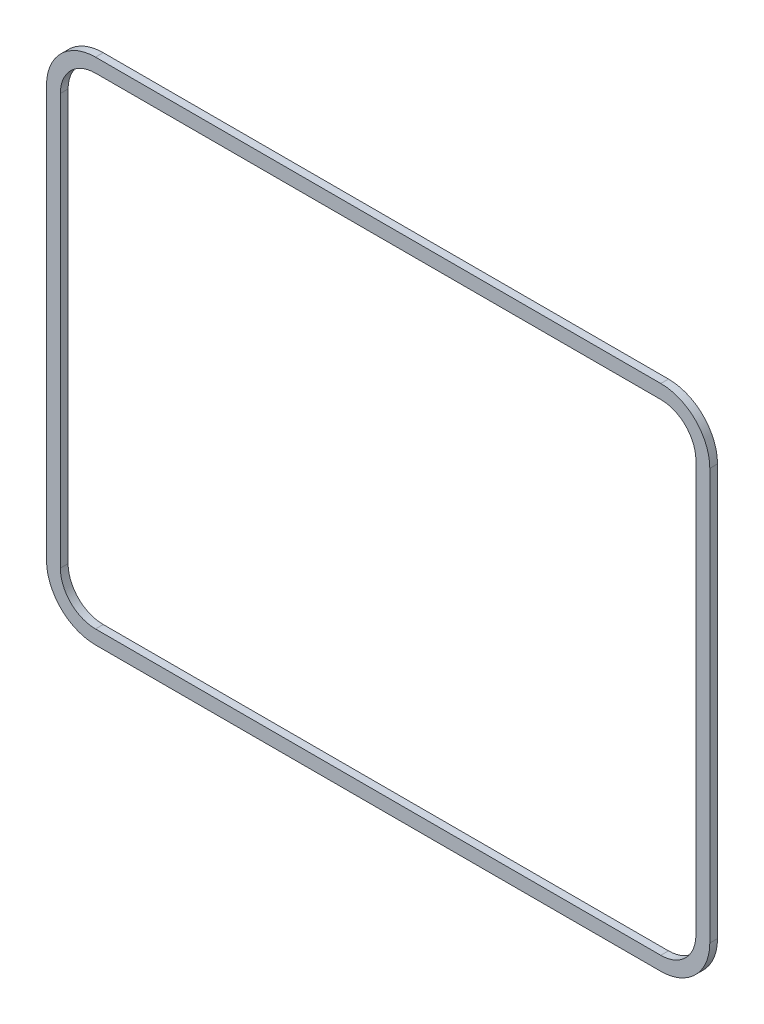
ISO-10303-21;
HEADER;
FILE_DESCRIPTION(('STEP AP214'),'2;1');
FILE_NAME('part.step','',(''),(''),'','','');
FILE_SCHEMA(('AUTOMOTIVE_DESIGN { 1 0 10303 214 1 1 1 1 }'));
ENDSEC;
DATA;
#1=APPLICATION_CONTEXT('core data for automotive mechanical design processes');
#2=APPLICATION_PROTOCOL_DEFINITION('international standard','automotive_design',2000,#1);
#3=PRODUCT_CONTEXT('',#1,'mechanical');
#4=PRODUCT('Part','Part','',(#3));
#5=PRODUCT_RELATED_PRODUCT_CATEGORY('part','',(#4));
#6=PRODUCT_DEFINITION_FORMATION('','',#4);
#7=PRODUCT_DEFINITION_CONTEXT('part definition',#1,'design');
#8=PRODUCT_DEFINITION('design','',#6,#7);
#9=PRODUCT_DEFINITION_SHAPE('','',#8);
#10=(LENGTH_UNIT() NAMED_UNIT(*) SI_UNIT(.MILLI.,.METRE.));
#11=(NAMED_UNIT(*) PLANE_ANGLE_UNIT() SI_UNIT($,.RADIAN.));
#12=(NAMED_UNIT(*) SI_UNIT($,.STERADIAN.) SOLID_ANGLE_UNIT());
#13=UNCERTAINTY_MEASURE_WITH_UNIT(LENGTH_MEASURE(1.E-05),#10,'distance_accuracy_value','');
#14=(GEOMETRIC_REPRESENTATION_CONTEXT(3) GLOBAL_UNCERTAINTY_ASSIGNED_CONTEXT((#13)) GLOBAL_UNIT_ASSIGNED_CONTEXT((#10,
#11,#12)) REPRESENTATION_CONTEXT('',''));
#15=CARTESIAN_POINT('',(0.,0.,0.));
#16=DIRECTION('',(0.,0.,1.));
#17=DIRECTION('',(1.,0.,0.));
#18=AXIS2_PLACEMENT_3D('',#15,#16,#17);
#19=CARTESIAN_POINT('',(-93.1,67.7,-2.54));
#20=DIRECTION('',(0.,0.,1.));
#21=DIRECTION('',(1.,0.,0.));
#22=AXIS2_PLACEMENT_3D('',#19,#20,#21);
#23=CYLINDRICAL_SURFACE('',#22,16.1454);
#24=CARTESIAN_POINT('',(-93.1,67.7,0.));
#25=DIRECTION('',(0.,0.,1.));
#26=DIRECTION('',(1.,0.,0.));
#27=AXIS2_PLACEMENT_3D('',#24,#25,#26);
#28=CIRCLE('',#27,16.1454);
#29=CARTESIAN_POINT('',(-93.1,83.8454,0.));
#30=VERTEX_POINT('',#29);
#31=CARTESIAN_POINT('',(-109.2454,67.7,0.));
#32=VERTEX_POINT('',#31);
#33=EDGE_CURVE('E209',#30,#32,#28,.T.);
#34=ORIENTED_EDGE('',*,*,#33,.F.);
#35=DIRECTION('',(0.,0.,1.));
#36=VECTOR('',#35,1.);
#37=CARTESIAN_POINT('',(-93.1,83.8454,-2.54));
#38=LINE('',#37,#36);
#39=CARTESIAN_POINT('',(-93.1,83.8454,-2.54));
#40=VERTEX_POINT('',#39);
#41=EDGE_CURVE('E11',#40,#30,#38,.T.);
#42=ORIENTED_EDGE('',*,*,#41,.F.);
#43=CARTESIAN_POINT('',(-93.1,67.7,-2.54));
#44=DIRECTION('',(0.,0.,1.));
#45=DIRECTION('',(1.,0.,0.));
#46=AXIS2_PLACEMENT_3D('',#43,#44,#45);
#47=CIRCLE('',#46,16.1454);
#48=CARTESIAN_POINT('',(-109.2454,67.7,-2.54));
#49=VERTEX_POINT('',#48);
#50=EDGE_CURVE('E221',#40,#49,#47,.T.);
#51=ORIENTED_EDGE('',*,*,#50,.T.);
#52=DIRECTION('',(0.,0.,1.));
#53=VECTOR('',#52,1.);
#54=CARTESIAN_POINT('',(-109.2454,67.7,-2.54));
#55=LINE('',#54,#53);
#56=EDGE_CURVE('E42',#49,#32,#55,.T.);
#57=ORIENTED_EDGE('',*,*,#56,.T.);
#58=EDGE_LOOP('',(#34,#42,#51,#57));
#59=FACE_BOUND('',#58,.T.);
#60=ADVANCED_FACE('F39',(#59),#23,.T.);
#61=CARTESIAN_POINT('',(92.1000000000002,83.8453999999991,-2.54));
#62=DIRECTION('',(0.,1.,0.));
#63=DIRECTION('',(-1.,0.,0.));
#64=AXIS2_PLACEMENT_3D('',#61,#62,#63);
#65=PLANE('',#64);
#66=DIRECTION('',(-1.,0.,0.));
#67=VECTOR('',#66,1.);
#68=CARTESIAN_POINT('',(92.1000000000002,83.8453999999991,0.));
#69=LINE('',#68,#67);
#70=CARTESIAN_POINT('',(93.1000000000001,83.8454,0.));
#71=VERTEX_POINT('',#70);
#72=EDGE_CURVE('E225',#71,#30,#69,.T.);
#73=ORIENTED_EDGE('',*,*,#72,.F.);
#74=DIRECTION('',(0.,0.,1.));
#75=VECTOR('',#74,1.);
#76=CARTESIAN_POINT('',(93.1000000000001,83.8454,-2.54));
#77=LINE('',#76,#75);
#78=CARTESIAN_POINT('',(93.1000000000001,83.8454,-2.54));
#79=VERTEX_POINT('',#78);
#80=EDGE_CURVE('E47',#79,#71,#77,.T.);
#81=ORIENTED_EDGE('',*,*,#80,.F.);
#82=DIRECTION('',(-1.,-9.29811783123658E-13,0.));
#83=VECTOR('',#82,1.);
#84=CARTESIAN_POINT('',(92.1000000000002,83.8453999999991,-2.54));
#85=LINE('',#84,#83);
#86=EDGE_CURVE('E240',#79,#40,#85,.T.);
#87=ORIENTED_EDGE('',*,*,#86,.T.);
#88=ORIENTED_EDGE('',*,*,#41,.T.);
#89=EDGE_LOOP('',(#73,#81,#87,#88));
#90=FACE_BOUND('',#89,.T.);
#91=ADVANCED_FACE('F289',(#90),#65,.T.);
#92=CARTESIAN_POINT('',(93.1,67.7,-2.54));
#93=DIRECTION('',(0.,0.,1.));
#94=DIRECTION('',(1.,0.,0.));
#95=AXIS2_PLACEMENT_3D('',#92,#93,#94);
#96=CYLINDRICAL_SURFACE('',#95,16.1454000000034);
#97=CARTESIAN_POINT('',(93.1,67.7,0.));
#98=DIRECTION('',(0.,0.,1.));
#99=DIRECTION('',(1.,0.,0.));
#100=AXIS2_PLACEMENT_3D('',#97,#98,#99);
#101=CIRCLE('',#100,16.1454000000034);
#102=CARTESIAN_POINT('',(109.245400000003,67.7,0.));
#103=VERTEX_POINT('',#102);
#104=EDGE_CURVE('E259',#103,#71,#101,.T.);
#105=ORIENTED_EDGE('',*,*,#104,.F.);
#106=DIRECTION('',(0.,0.,1.));
#107=VECTOR('',#106,1.);
#108=CARTESIAN_POINT('',(109.245400000003,67.7,-2.54));
#109=LINE('',#108,#107);
#110=CARTESIAN_POINT('',(109.245400000003,67.7,-2.54));
#111=VERTEX_POINT('',#110);
#112=EDGE_CURVE('E266',#111,#103,#109,.T.);
#113=ORIENTED_EDGE('',*,*,#112,.F.);
#114=CARTESIAN_POINT('',(93.1,67.7,-2.54));
#115=DIRECTION('',(0.,0.,1.));
#116=DIRECTION('',(1.,0.,0.));
#117=AXIS2_PLACEMENT_3D('',#114,#115,#116);
#118=CIRCLE('',#117,16.1454000000034);
#119=EDGE_CURVE('E237',#111,#79,#118,.T.);
#120=ORIENTED_EDGE('',*,*,#119,.T.);
#121=ORIENTED_EDGE('',*,*,#80,.T.);
#122=EDGE_LOOP('',(#105,#113,#120,#121));
#123=FACE_BOUND('',#122,.T.);
#124=ADVANCED_FACE('F292',(#123),#96,.T.);
#125=CARTESIAN_POINT('',(109.245400000007,-66.6999999999886,-2.54));
#126=DIRECTION('',(1.,0.,0.));
#127=DIRECTION('',(0.,0.,-1.));
#128=AXIS2_PLACEMENT_3D('',#125,#126,#127);
#129=PLANE('',#128);
#130=DIRECTION('',(0.,1.,0.));
#131=VECTOR('',#130,1.);
#132=CARTESIAN_POINT('',(109.245400000007,-66.6999999999886,0.));
#133=LINE('',#132,#131);
#134=CARTESIAN_POINT('',(109.245399999993,-67.700000000004,0.));
#135=VERTEX_POINT('',#134);
#136=EDGE_CURVE('E256',#135,#103,#133,.T.);
#137=ORIENTED_EDGE('',*,*,#136,.F.);
#138=DIRECTION('',(0.,0.,1.));
#139=VECTOR('',#138,1.);
#140=CARTESIAN_POINT('',(109.245399999993,-67.700000000004,-2.54));
#141=LINE('',#140,#139);
#142=CARTESIAN_POINT('',(109.245399999993,-67.700000000004,-2.54));
#143=VERTEX_POINT('',#142);
#144=EDGE_CURVE('E268',#143,#135,#141,.T.);
#145=ORIENTED_EDGE('',*,*,#144,.F.);
#146=DIRECTION('',(1.41553435637533E-11,1.,0.));
#147=VECTOR('',#146,1.);
#148=CARTESIAN_POINT('',(109.245399999993,-67.700000000004,-2.54));
#149=LINE('',#148,#147);
#150=EDGE_CURVE('E235',#143,#111,#149,.T.);
#151=ORIENTED_EDGE('',*,*,#150,.T.);
#152=ORIENTED_EDGE('',*,*,#112,.T.);
#153=EDGE_LOOP('',(#137,#145,#151,#152));
#154=FACE_BOUND('',#153,.T.);
#155=ADVANCED_FACE('F309',(#154),#129,.T.);
#156=CARTESIAN_POINT('',(93.0999999999926,-67.7000000000038,-2.54));
#157=DIRECTION('',(0.,0.,1.));
#158=DIRECTION('',(1.,0.,0.));
#159=AXIS2_PLACEMENT_3D('',#156,#157,#158);
#160=CYLINDRICAL_SURFACE('',#159,16.1454);
#161=CARTESIAN_POINT('',(93.0999999999926,-67.7000000000038,0.));
#162=DIRECTION('',(0.,0.,1.));
#163=DIRECTION('',(1.,0.,0.));
#164=AXIS2_PLACEMENT_3D('',#161,#162,#163);
#165=CIRCLE('',#164,16.1454);
#166=CARTESIAN_POINT('',(93.0999999999924,-83.8454000000038,0.));
#167=VERTEX_POINT('',#166);
#168=EDGE_CURVE('E253',#167,#135,#165,.T.);
#169=ORIENTED_EDGE('',*,*,#168,.F.);
#170=DIRECTION('',(0.,0.,1.));
#171=VECTOR('',#170,1.);
#172=CARTESIAN_POINT('',(93.0999999999924,-83.8454000000038,-2.54));
#173=LINE('',#172,#171);
#174=CARTESIAN_POINT('',(93.0999999999924,-83.8454000000038,-2.54));
#175=VERTEX_POINT('',#174);
#176=EDGE_CURVE('E271',#175,#167,#173,.T.);
#177=ORIENTED_EDGE('',*,*,#176,.F.);
#178=CARTESIAN_POINT('',(93.0999999999926,-67.7000000000038,-2.54));
#179=DIRECTION('',(0.,0.,1.));
#180=DIRECTION('',(1.,0.,0.));
#181=AXIS2_PLACEMENT_3D('',#178,#179,#180);
#182=CIRCLE('',#181,16.1454);
#183=EDGE_CURVE('E232',#175,#143,#182,.T.);
#184=ORIENTED_EDGE('',*,*,#183,.T.);
#185=ORIENTED_EDGE('',*,*,#144,.T.);
#186=EDGE_LOOP('',(#169,#177,#184,#185));
#187=FACE_BOUND('',#186,.T.);
#188=ADVANCED_FACE('F307',(#187),#160,.T.);
#189=CARTESIAN_POINT('',(93.0999999999924,-83.8454000000038,-2.54));
#190=DIRECTION('',(0.,-1.,0.));
#191=DIRECTION('',(1.,0.,0.));
#192=AXIS2_PLACEMENT_3D('',#189,#190,#191);
#193=PLANE('',#192);
#194=DIRECTION('',(1.,0.,0.));
#195=VECTOR('',#194,1.);
#196=CARTESIAN_POINT('',(93.0999999999924,-83.8454000000038,0.));
#197=LINE('',#196,#195);
#198=CARTESIAN_POINT('',(-93.1000000000148,-83.8454000000055,0.));
#199=VERTEX_POINT('',#198);
#200=EDGE_CURVE('E250',#199,#167,#197,.T.);
#201=ORIENTED_EDGE('',*,*,#200,.F.);
#202=DIRECTION('',(0.,0.,1.));
#203=VECTOR('',#202,1.);
#204=CARTESIAN_POINT('',(-93.1000000000148,-83.8454000000055,-2.54));
#205=LINE('',#204,#203);
#206=CARTESIAN_POINT('',(-93.1000000000148,-83.8454000000055,-2.54));
#207=VERTEX_POINT('',#206);
#208=EDGE_CURVE('E273',#207,#199,#205,.T.);
#209=ORIENTED_EDGE('',*,*,#208,.F.);
#210=DIRECTION('',(1.,0.,0.));
#211=VECTOR('',#210,1.);
#212=CARTESIAN_POINT('',(-93.1000000000148,-83.8454000000055,-2.54));
#213=LINE('',#212,#211);
#214=EDGE_CURVE('E230',#207,#175,#213,.T.);
#215=ORIENTED_EDGE('',*,*,#214,.T.);
#216=ORIENTED_EDGE('',*,*,#176,.T.);
#217=EDGE_LOOP('',(#201,#209,#215,#216));
#218=FACE_BOUND('',#217,.T.);
#219=ADVANCED_FACE('F304',(#218),#193,.T.);
#220=CARTESIAN_POINT('',(-93.1000000000147,-67.7000000000055,-2.54));
#221=DIRECTION('',(0.,0.,1.));
#222=DIRECTION('',(1.,0.,0.));
#223=AXIS2_PLACEMENT_3D('',#220,#221,#222);
#224=CYLINDRICAL_SURFACE('',#223,16.1454);
#225=CARTESIAN_POINT('',(-93.1000000000147,-67.7000000000055,0.));
#226=DIRECTION('',(0.,0.,1.));
#227=DIRECTION('',(1.,0.,0.));
#228=AXIS2_PLACEMENT_3D('',#225,#226,#227);
#229=CIRCLE('',#228,16.1454);
#230=CARTESIAN_POINT('',(-109.245400000015,-67.7000000000053,0.));
#231=VERTEX_POINT('',#230);
#232=EDGE_CURVE('E247',#231,#199,#229,.T.);
#233=ORIENTED_EDGE('',*,*,#232,.F.);
#234=DIRECTION('',(0.,0.,1.));
#235=VECTOR('',#234,1.);
#236=CARTESIAN_POINT('',(-109.245400000015,-67.7000000000053,-2.54));
#237=LINE('',#236,#235);
#238=CARTESIAN_POINT('',(-109.245400000015,-67.7000000000053,-2.54));
#239=VERTEX_POINT('',#238);
#240=EDGE_CURVE('E275',#239,#231,#237,.T.);
#241=ORIENTED_EDGE('',*,*,#240,.F.);
#242=CARTESIAN_POINT('',(-93.1000000000147,-67.7000000000055,-2.54));
#243=DIRECTION('',(0.,0.,1.));
#244=DIRECTION('',(1.,0.,0.));
#245=AXIS2_PLACEMENT_3D('',#242,#243,#244);
#246=CIRCLE('',#245,16.1454);
#247=EDGE_CURVE('E227',#239,#207,#246,.T.);
#248=ORIENTED_EDGE('',*,*,#247,.T.);
#249=ORIENTED_EDGE('',*,*,#208,.T.);
#250=EDGE_LOOP('',(#233,#241,#248,#249));
#251=FACE_BOUND('',#250,.T.);
#252=ADVANCED_FACE('F301',(#251),#224,.T.);
#253=CARTESIAN_POINT('',(-109.245400000015,-67.7000000000053,-2.54));
#254=DIRECTION('',(-1.,0.,0.));
#255=DIRECTION('',(0.,0.,1.));
#256=AXIS2_PLACEMENT_3D('',#253,#254,#255);
#257=PLANE('',#256);
#258=DIRECTION('',(0.,-1.,0.));
#259=VECTOR('',#258,1.);
#260=CARTESIAN_POINT('',(-109.245400000015,-67.7000000000053,0.));
#261=LINE('',#260,#259);
#262=EDGE_CURVE('E244',#32,#231,#261,.T.);
#263=ORIENTED_EDGE('',*,*,#262,.F.);
#264=ORIENTED_EDGE('',*,*,#56,.F.);
#265=DIRECTION('',(-1.09143018696872E-13,-1.,0.));
#266=VECTOR('',#265,1.);
#267=CARTESIAN_POINT('',(-109.245400000015,-66.7000000000024,-2.54));
#268=LINE('',#267,#266);
#269=EDGE_CURVE('E224',#49,#239,#268,.T.);
#270=ORIENTED_EDGE('',*,*,#269,.T.);
#271=ORIENTED_EDGE('',*,*,#240,.T.);
#272=EDGE_LOOP('',(#263,#264,#270,#271));
#273=FACE_BOUND('',#272,.T.);
#274=ADVANCED_FACE('F299',(#273),#257,.T.);
#275=CARTESIAN_POINT('',(-93.1,67.7,-2.54));
#276=DIRECTION('',(0.,0.,1.));
#277=DIRECTION('',(1.,0.,0.));
#278=AXIS2_PLACEMENT_3D('',#275,#276,#277);
#279=PLANE('',#278);
#280=DIRECTION('',(-1.,-9.29811783123684E-13,0.));
#281=VECTOR('',#280,1.);
#282=CARTESIAN_POINT('',(92.1000000000002,79.2733999999991,-2.54));
#283=LINE('',#282,#281);
#284=CARTESIAN_POINT('',(93.1,79.2734,-2.54));
#285=VERTEX_POINT('',#284);
#286=CARTESIAN_POINT('',(-93.1,79.2734,-2.54));
#287=VERTEX_POINT('',#286);
#288=EDGE_CURVE('E160',#285,#287,#283,.T.);
#289=ORIENTED_EDGE('',*,*,#288,.T.);
#290=CARTESIAN_POINT('',(-93.1,67.7,-2.54));
#291=DIRECTION('',(0.,0.,1.));
#292=DIRECTION('',(1.,0.,0.));
#293=AXIS2_PLACEMENT_3D('',#290,#291,#292);
#294=CIRCLE('',#293,11.5734);
#295=CARTESIAN_POINT('',(-104.6734,67.7,-2.54));
#296=VERTEX_POINT('',#295);
#297=EDGE_CURVE('E154',#287,#296,#294,.T.);
#298=ORIENTED_EDGE('',*,*,#297,.T.);
#299=DIRECTION('',(-1.09143018696872E-13,-1.,0.));
#300=VECTOR('',#299,1.);
#301=CARTESIAN_POINT('',(-104.673400000015,-66.7000000000024,-2.54));
#302=LINE('',#301,#300);
#303=CARTESIAN_POINT('',(-104.673400000015,-67.7000000000053,-2.54));
#304=VERTEX_POINT('',#303);
#305=EDGE_CURVE('E163',#296,#304,#302,.T.);
#306=ORIENTED_EDGE('',*,*,#305,.T.);
#307=CARTESIAN_POINT('',(-93.1000000000147,-67.7000000000055,-2.54));
#308=DIRECTION('',(0.,0.,1.));
#309=DIRECTION('',(1.,0.,0.));
#310=AXIS2_PLACEMENT_3D('',#307,#308,#309);
#311=CIRCLE('',#310,11.5734);
#312=CARTESIAN_POINT('',(-93.1000000000148,-79.2734000000055,-2.54));
#313=VERTEX_POINT('',#312);
#314=EDGE_CURVE('E55',#304,#313,#311,.T.);
#315=ORIENTED_EDGE('',*,*,#314,.T.);
#316=DIRECTION('',(1.,0.,0.));
#317=VECTOR('',#316,1.);
#318=CARTESIAN_POINT('',(-93.1000000000148,-79.2734000000055,-2.54));
#319=LINE('',#318,#317);
#320=CARTESIAN_POINT('',(93.0999999999924,-79.2734000000046,-2.54));
#321=VERTEX_POINT('',#320);
#322=EDGE_CURVE('E178',#313,#321,#319,.T.);
#323=ORIENTED_EDGE('',*,*,#322,.T.);
#324=CARTESIAN_POINT('',(93.0999999999926,-67.7000000000038,-2.54));
#325=DIRECTION('',(0.,0.,1.));
#326=DIRECTION('',(1.,0.,0.));
#327=AXIS2_PLACEMENT_3D('',#324,#325,#326);
#328=CIRCLE('',#327,11.5734000000008);
#329=CARTESIAN_POINT('',(104.673399999993,-67.7000000000039,-2.54));
#330=VERTEX_POINT('',#329);
#331=EDGE_CURVE('E181',#321,#330,#328,.T.);
#332=ORIENTED_EDGE('',*,*,#331,.T.);
#333=DIRECTION('',(1.41553435628378E-11,1.,0.));
#334=VECTOR('',#333,1.);
#335=CARTESIAN_POINT('',(104.673399999993,-67.7000000000039,-2.54));
#336=LINE('',#335,#334);
#337=CARTESIAN_POINT('',(104.673400000003,67.7,-2.54));
#338=VERTEX_POINT('',#337);
#339=EDGE_CURVE('E184',#330,#338,#336,.T.);
#340=ORIENTED_EDGE('',*,*,#339,.T.);
#341=CARTESIAN_POINT('',(93.1,67.7,-2.54));
#342=DIRECTION('',(0.,0.,1.));
#343=DIRECTION('',(1.,0.,0.));
#344=AXIS2_PLACEMENT_3D('',#341,#342,#343);
#345=CIRCLE('',#344,11.5734000000034);
#346=EDGE_CURVE('E187',#338,#285,#345,.T.);
#347=ORIENTED_EDGE('',*,*,#346,.T.);
#348=EDGE_LOOP('',(#289,#298,#306,#315,#323,#332,#340,#347));
#349=FACE_BOUND('',#348,.T.);
#350=ORIENTED_EDGE('',*,*,#50,.F.);
#351=ORIENTED_EDGE('',*,*,#86,.F.);
#352=ORIENTED_EDGE('',*,*,#119,.F.);
#353=ORIENTED_EDGE('',*,*,#150,.F.);
#354=ORIENTED_EDGE('',*,*,#183,.F.);
#355=ORIENTED_EDGE('',*,*,#214,.F.);
#356=ORIENTED_EDGE('',*,*,#247,.F.);
#357=ORIENTED_EDGE('',*,*,#269,.F.);
#358=EDGE_LOOP('',(#350,#351,#352,#353,#354,#355,#356,#357));
#359=FACE_BOUND('',#358,.T.);
#360=ADVANCED_FACE('F167',(#349,#359),#279,.F.);
#361=CARTESIAN_POINT('',(-93.1,67.7,0.));
#362=DIRECTION('',(0.,0.,1.));
#363=DIRECTION('',(1.,0.,0.));
#364=AXIS2_PLACEMENT_3D('',#361,#362,#363);
#365=PLANE('',#364);
#366=CARTESIAN_POINT('',(-93.1,67.7,0.));
#367=DIRECTION('',(0.,0.,1.));
#368=DIRECTION('',(1.,0.,0.));
#369=AXIS2_PLACEMENT_3D('',#366,#367,#368);
#370=CIRCLE('',#369,11.5734);
#371=CARTESIAN_POINT('',(-93.1,79.2734,0.));
#372=VERTEX_POINT('',#371);
#373=CARTESIAN_POINT('',(-104.673400000015,67.7,0.));
#374=VERTEX_POINT('',#373);
#375=EDGE_CURVE('E63',#372,#374,#370,.T.);
#376=ORIENTED_EDGE('',*,*,#375,.F.);
#377=DIRECTION('',(-1.,0.,0.));
#378=VECTOR('',#377,1.);
#379=CARTESIAN_POINT('',(92.1000000000002,79.2733999999991,0.));
#380=LINE('',#379,#378);
#381=CARTESIAN_POINT('',(93.1,79.2734,0.));
#382=VERTEX_POINT('',#381);
#383=EDGE_CURVE('E171',#382,#372,#380,.T.);
#384=ORIENTED_EDGE('',*,*,#383,.F.);
#385=CARTESIAN_POINT('',(93.1,67.7,0.));
#386=DIRECTION('',(0.,0.,1.));
#387=DIRECTION('',(1.,0.,0.));
#388=AXIS2_PLACEMENT_3D('',#385,#386,#387);
#389=CIRCLE('',#388,11.5734000000034);
#390=CARTESIAN_POINT('',(104.673400000003,67.7,0.));
#391=VERTEX_POINT('',#390);
#392=EDGE_CURVE('E174',#391,#382,#389,.T.);
#393=ORIENTED_EDGE('',*,*,#392,.F.);
#394=DIRECTION('',(0.,1.,0.));
#395=VECTOR('',#394,1.);
#396=CARTESIAN_POINT('',(104.673400000007,-66.6999999999239,0.));
#397=LINE('',#396,#395);
#398=CARTESIAN_POINT('',(104.673399999993,-67.7000000000039,0.));
#399=VERTEX_POINT('',#398);
#400=EDGE_CURVE('E202',#399,#391,#397,.T.);
#401=ORIENTED_EDGE('',*,*,#400,.F.);
#402=CARTESIAN_POINT('',(93.0999999999926,-67.7000000000038,0.));
#403=DIRECTION('',(0.,0.,1.));
#404=DIRECTION('',(1.,0.,0.));
#405=AXIS2_PLACEMENT_3D('',#402,#403,#404);
#406=CIRCLE('',#405,11.5734000000008);
#407=CARTESIAN_POINT('',(93.0999999999924,-79.2734000000046,0.));
#408=VERTEX_POINT('',#407);
#409=EDGE_CURVE('E199',#408,#399,#406,.T.);
#410=ORIENTED_EDGE('',*,*,#409,.F.);
#411=DIRECTION('',(1.,0.,0.));
#412=VECTOR('',#411,1.);
#413=CARTESIAN_POINT('',(93.0999999999924,-79.2734000000055,0.));
#414=LINE('',#413,#412);
#415=CARTESIAN_POINT('',(-93.1000000000148,-79.2734000000055,0.));
#416=VERTEX_POINT('',#415);
#417=EDGE_CURVE('E196',#416,#408,#414,.T.);
#418=ORIENTED_EDGE('',*,*,#417,.F.);
#419=CARTESIAN_POINT('',(-93.1000000000147,-67.7000000000055,0.));
#420=DIRECTION('',(0.,0.,1.));
#421=DIRECTION('',(1.,0.,0.));
#422=AXIS2_PLACEMENT_3D('',#419,#420,#421);
#423=CIRCLE('',#422,11.5734);
#424=CARTESIAN_POINT('',(-104.673400000015,-67.7000000000053,0.));
#425=VERTEX_POINT('',#424);
#426=EDGE_CURVE('E193',#425,#416,#423,.T.);
#427=ORIENTED_EDGE('',*,*,#426,.F.);
#428=DIRECTION('',(0.,-1.,0.));
#429=VECTOR('',#428,1.);
#430=CARTESIAN_POINT('',(-104.673400000015,-67.7000000000053,0.));
#431=LINE('',#430,#429);
#432=EDGE_CURVE('E191',#374,#425,#431,.T.);
#433=ORIENTED_EDGE('',*,*,#432,.F.);
#434=EDGE_LOOP('',(#376,#384,#393,#401,#410,#418,#427,#433));
#435=FACE_BOUND('',#434,.T.);
#436=ORIENTED_EDGE('',*,*,#33,.T.);
#437=ORIENTED_EDGE('',*,*,#262,.T.);
#438=ORIENTED_EDGE('',*,*,#232,.T.);
#439=ORIENTED_EDGE('',*,*,#200,.T.);
#440=ORIENTED_EDGE('',*,*,#168,.T.);
#441=ORIENTED_EDGE('',*,*,#136,.T.);
#442=ORIENTED_EDGE('',*,*,#104,.T.);
#443=ORIENTED_EDGE('',*,*,#72,.T.);
#444=EDGE_LOOP('',(#436,#437,#438,#439,#440,#441,#442,#443));
#445=FACE_BOUND('',#444,.T.);
#446=ADVANCED_FACE('F286',(#435,#445),#365,.T.);
#447=CARTESIAN_POINT('',(-93.1,67.7,-2.54));
#448=DIRECTION('',(0.,0.,1.));
#449=DIRECTION('',(1.,0.,0.));
#450=AXIS2_PLACEMENT_3D('',#447,#448,#449);
#451=CYLINDRICAL_SURFACE('',#450,11.5734);
#452=ORIENTED_EDGE('',*,*,#375,.T.);
#453=DIRECTION('',(0.,0.,1.));
#454=VECTOR('',#453,1.);
#455=CARTESIAN_POINT('',(-104.6734,67.7,-2.54));
#456=LINE('',#455,#454);
#457=EDGE_CURVE('E150',#296,#374,#456,.T.);
#458=ORIENTED_EDGE('',*,*,#457,.F.);
#459=ORIENTED_EDGE('',*,*,#297,.F.);
#460=DIRECTION('',(0.,0.,1.));
#461=VECTOR('',#460,1.);
#462=CARTESIAN_POINT('',(-93.1,79.2734,-2.54));
#463=LINE('',#462,#461);
#464=EDGE_CURVE('E207',#287,#372,#463,.T.);
#465=ORIENTED_EDGE('',*,*,#464,.T.);
#466=EDGE_LOOP('',(#452,#458,#459,#465));
#467=FACE_BOUND('',#466,.T.);
#468=ADVANCED_FACE('F152',(#467),#451,.F.);
#469=CARTESIAN_POINT('',(92.1000000000002,79.2733999999991,-2.54));
#470=DIRECTION('',(0.,1.,0.));
#471=DIRECTION('',(-1.,0.,0.));
#472=AXIS2_PLACEMENT_3D('',#469,#470,#471);
#473=PLANE('',#472);
#474=ORIENTED_EDGE('',*,*,#383,.T.);
#475=ORIENTED_EDGE('',*,*,#464,.F.);
#476=ORIENTED_EDGE('',*,*,#288,.F.);
#477=DIRECTION('',(0.,0.,1.));
#478=VECTOR('',#477,1.);
#479=CARTESIAN_POINT('',(93.1,79.2734,-2.54));
#480=LINE('',#479,#478);
#481=EDGE_CURVE('E210',#285,#382,#480,.T.);
#482=ORIENTED_EDGE('',*,*,#481,.T.);
#483=EDGE_LOOP('',(#474,#475,#476,#482));
#484=FACE_BOUND('',#483,.T.);
#485=ADVANCED_FACE('F333',(#484),#473,.F.);
#486=CARTESIAN_POINT('',(93.1,67.7,-2.54));
#487=DIRECTION('',(0.,0.,1.));
#488=DIRECTION('',(1.,0.,0.));
#489=AXIS2_PLACEMENT_3D('',#486,#487,#488);
#490=CYLINDRICAL_SURFACE('',#489,11.5734000000034);
#491=ORIENTED_EDGE('',*,*,#392,.T.);
#492=ORIENTED_EDGE('',*,*,#481,.F.);
#493=ORIENTED_EDGE('',*,*,#346,.F.);
#494=DIRECTION('',(0.,0.,1.));
#495=VECTOR('',#494,1.);
#496=CARTESIAN_POINT('',(104.673400000003,67.7,-2.54));
#497=LINE('',#496,#495);
#498=EDGE_CURVE('E212',#338,#391,#497,.T.);
#499=ORIENTED_EDGE('',*,*,#498,.T.);
#500=EDGE_LOOP('',(#491,#492,#493,#499));
#501=FACE_BOUND('',#500,.T.);
#502=ADVANCED_FACE('F350',(#501),#490,.F.);
#503=CARTESIAN_POINT('',(104.673400000007,-66.6999999999239,-2.54));
#504=DIRECTION('',(1.,0.,0.));
#505=DIRECTION('',(0.,0.,-1.));
#506=AXIS2_PLACEMENT_3D('',#503,#504,#505);
#507=PLANE('',#506);
#508=ORIENTED_EDGE('',*,*,#400,.T.);
#509=ORIENTED_EDGE('',*,*,#498,.F.);
#510=ORIENTED_EDGE('',*,*,#339,.F.);
#511=DIRECTION('',(0.,0.,1.));
#512=VECTOR('',#511,1.);
#513=CARTESIAN_POINT('',(104.673399999993,-67.7000000000039,-2.54));
#514=LINE('',#513,#512);
#515=EDGE_CURVE('E214',#330,#399,#514,.T.);
#516=ORIENTED_EDGE('',*,*,#515,.T.);
#517=EDGE_LOOP('',(#508,#509,#510,#516));
#518=FACE_BOUND('',#517,.T.);
#519=ADVANCED_FACE('F346',(#518),#507,.F.);
#520=CARTESIAN_POINT('',(93.0999999999926,-67.7000000000038,-2.54));
#521=DIRECTION('',(0.,0.,1.));
#522=DIRECTION('',(1.,0.,0.));
#523=AXIS2_PLACEMENT_3D('',#520,#521,#522);
#524=CYLINDRICAL_SURFACE('',#523,11.5734000000008);
#525=ORIENTED_EDGE('',*,*,#409,.T.);
#526=ORIENTED_EDGE('',*,*,#515,.F.);
#527=ORIENTED_EDGE('',*,*,#331,.F.);
#528=DIRECTION('',(0.,0.,1.));
#529=VECTOR('',#528,1.);
#530=CARTESIAN_POINT('',(93.0999999999924,-79.2734000000046,-2.54));
#531=LINE('',#530,#529);
#532=EDGE_CURVE('E216',#321,#408,#531,.T.);
#533=ORIENTED_EDGE('',*,*,#532,.T.);
#534=EDGE_LOOP('',(#525,#526,#527,#533));
#535=FACE_BOUND('',#534,.T.);
#536=ADVANCED_FACE('F342',(#535),#524,.F.);
#537=CARTESIAN_POINT('',(93.0999999999924,-79.2734000000055,-2.54));
#538=DIRECTION('',(0.,-1.,0.));
#539=DIRECTION('',(1.,0.,0.));
#540=AXIS2_PLACEMENT_3D('',#537,#538,#539);
#541=PLANE('',#540);
#542=ORIENTED_EDGE('',*,*,#417,.T.);
#543=ORIENTED_EDGE('',*,*,#532,.F.);
#544=ORIENTED_EDGE('',*,*,#322,.F.);
#545=DIRECTION('',(0.,0.,1.));
#546=VECTOR('',#545,1.);
#547=CARTESIAN_POINT('',(-93.1000000000148,-79.2734000000055,-2.54));
#548=LINE('',#547,#546);
#549=EDGE_CURVE('E218',#313,#416,#548,.T.);
#550=ORIENTED_EDGE('',*,*,#549,.T.);
#551=EDGE_LOOP('',(#542,#543,#544,#550));
#552=FACE_BOUND('',#551,.T.);
#553=ADVANCED_FACE('F339',(#552),#541,.F.);
#554=CARTESIAN_POINT('',(-93.1000000000147,-67.7000000000055,-2.54));
#555=DIRECTION('',(0.,0.,1.));
#556=DIRECTION('',(1.,0.,0.));
#557=AXIS2_PLACEMENT_3D('',#554,#555,#556);
#558=CYLINDRICAL_SURFACE('',#557,11.5734);
#559=ORIENTED_EDGE('',*,*,#426,.T.);
#560=ORIENTED_EDGE('',*,*,#549,.F.);
#561=ORIENTED_EDGE('',*,*,#314,.F.);
#562=DIRECTION('',(0.,0.,1.));
#563=VECTOR('',#562,1.);
#564=CARTESIAN_POINT('',(-104.673400000015,-67.7000000000053,-2.54));
#565=LINE('',#564,#563);
#566=EDGE_CURVE('E159',#304,#425,#565,.T.);
#567=ORIENTED_EDGE('',*,*,#566,.T.);
#568=EDGE_LOOP('',(#559,#560,#561,#567));
#569=FACE_BOUND('',#568,.T.);
#570=ADVANCED_FACE('F336',(#569),#558,.F.);
#571=CARTESIAN_POINT('',(-104.673400000015,-67.7000000000053,-2.54));
#572=DIRECTION('',(-1.,0.,0.));
#573=DIRECTION('',(0.,0.,1.));
#574=AXIS2_PLACEMENT_3D('',#571,#572,#573);
#575=PLANE('',#574);
#576=ORIENTED_EDGE('',*,*,#432,.T.);
#577=ORIENTED_EDGE('',*,*,#566,.F.);
#578=ORIENTED_EDGE('',*,*,#305,.F.);
#579=ORIENTED_EDGE('',*,*,#457,.T.);
#580=EDGE_LOOP('',(#576,#577,#578,#579));
#581=FACE_BOUND('',#580,.T.);
#582=ADVANCED_FACE('F164',(#581),#575,.F.);
#583=CLOSED_SHELL('',(#60,#91,#124,#155,#188,#219,#252,#274,#360,#446,#468,#485,#502,#519,#536,
#553,#570,#582));
#584=MANIFOLD_SOLID_BREP('B2',#583);
#585=ADVANCED_BREP_SHAPE_REPRESENTATION('',(#18,#584),#14);
#586=SHAPE_DEFINITION_REPRESENTATION(#9,#585);
ENDSEC;
END-ISO-10303-21;
